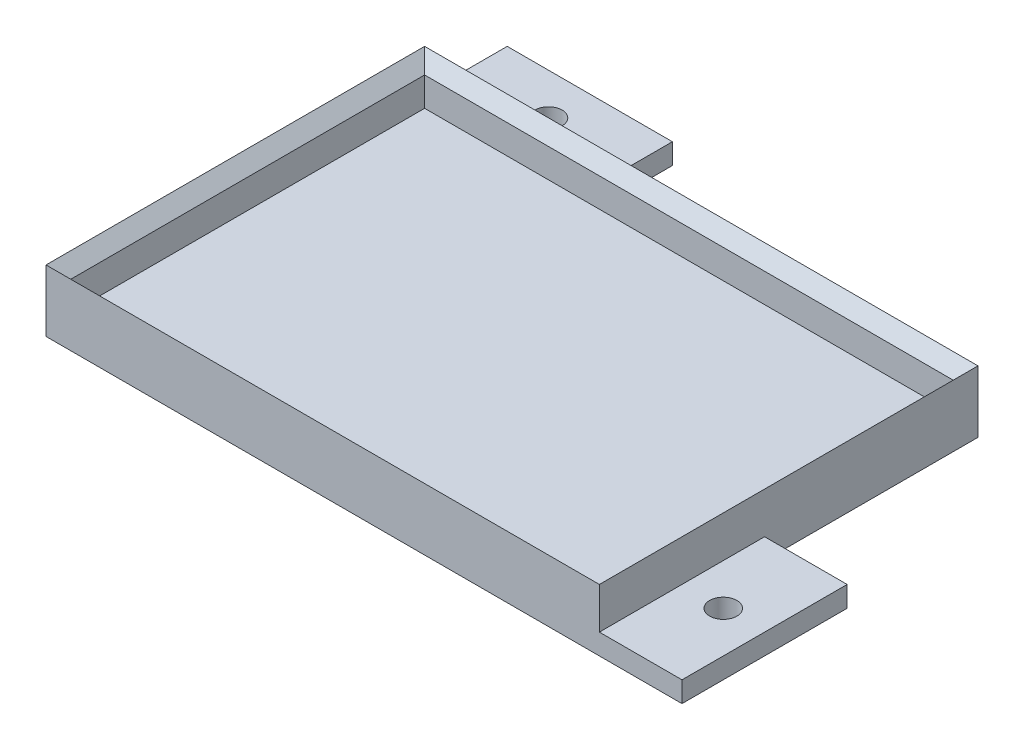
ISO-10303-21;
HEADER;
FILE_DESCRIPTION(('STEP AP214'),'2;1');
FILE_NAME('part.step','',(''),(''),'','','');
FILE_SCHEMA(('AUTOMOTIVE_DESIGN { 1 0 10303 214 1 1 1 1 }'));
ENDSEC;
DATA;
#1=APPLICATION_CONTEXT('core data for automotive mechanical design processes');
#2=APPLICATION_PROTOCOL_DEFINITION('international standard','automotive_design',2000,#1);
#3=PRODUCT_CONTEXT('',#1,'mechanical');
#4=PRODUCT('Part','Part','',(#3));
#5=PRODUCT_RELATED_PRODUCT_CATEGORY('part','',(#4));
#6=PRODUCT_DEFINITION_FORMATION('','',#4);
#7=PRODUCT_DEFINITION_CONTEXT('part definition',#1,'design');
#8=PRODUCT_DEFINITION('design','',#6,#7);
#9=PRODUCT_DEFINITION_SHAPE('','',#8);
#10=(LENGTH_UNIT() NAMED_UNIT(*) SI_UNIT(.MILLI.,.METRE.));
#11=(NAMED_UNIT(*) PLANE_ANGLE_UNIT() SI_UNIT($,.RADIAN.));
#12=(NAMED_UNIT(*) SI_UNIT($,.STERADIAN.) SOLID_ANGLE_UNIT());
#13=UNCERTAINTY_MEASURE_WITH_UNIT(LENGTH_MEASURE(1.E-05),#10,'distance_accuracy_value','');
#14=(GEOMETRIC_REPRESENTATION_CONTEXT(3) GLOBAL_UNCERTAINTY_ASSIGNED_CONTEXT((#13)) GLOBAL_UNIT_ASSIGNED_CONTEXT((#10,
#11,#12)) REPRESENTATION_CONTEXT('',''));
#15=CARTESIAN_POINT('',(0.,0.,0.));
#16=DIRECTION('',(0.,0.,1.));
#17=DIRECTION('',(1.,0.,0.));
#18=AXIS2_PLACEMENT_3D('',#15,#16,#17);
#19=CARTESIAN_POINT('',(0.,5.,0.));
#20=DIRECTION('',(0.,1.,0.));
#21=DIRECTION('',(0.,0.,1.));
#22=AXIS2_PLACEMENT_3D('',#19,#20,#21);
#23=PLANE('',#22);
#24=DIRECTION('',(0.,0.,-1.));
#25=VECTOR('',#24,1.);
#26=CARTESIAN_POINT('',(67.,5.,-45.84));
#27=LINE('',#26,#25);
#28=CARTESIAN_POINT('',(67.,5.,45.84));
#29=VERTEX_POINT('',#28);
#30=CARTESIAN_POINT('',(67.,5.,5.83999999999999));
#31=VERTEX_POINT('',#30);
#32=EDGE_CURVE('E161',#29,#31,#27,.T.);
#33=ORIENTED_EDGE('',*,*,#32,.F.);
#34=DIRECTION('',(1.,0.,0.));
#35=VECTOR('',#34,1.);
#36=CARTESIAN_POINT('',(-67.,5.,45.84));
#37=LINE('',#36,#35);
#38=CARTESIAN_POINT('',(87.,5.,45.84));
#39=VERTEX_POINT('',#38);
#40=EDGE_CURVE('E296',#29,#39,#37,.T.);
#41=ORIENTED_EDGE('',*,*,#40,.T.);
#42=DIRECTION('',(0.,0.,-1.));
#43=VECTOR('',#42,1.);
#44=CARTESIAN_POINT('',(87.,5.,45.84));
#45=LINE('',#44,#43);
#46=CARTESIAN_POINT('',(87.,5.,5.83999999999999));
#47=VERTEX_POINT('',#46);
#48=EDGE_CURVE('E259',#39,#47,#45,.T.);
#49=ORIENTED_EDGE('',*,*,#48,.T.);
#50=DIRECTION('',(-1.,0.,0.));
#51=VECTOR('',#50,1.);
#52=CARTESIAN_POINT('',(67.,5.,5.83999999999999));
#53=LINE('',#52,#51);
#54=EDGE_CURVE('E254',#47,#31,#53,.T.);
#55=ORIENTED_EDGE('',*,*,#54,.T.);
#56=EDGE_LOOP('',(#33,#41,#49,#55));
#57=FACE_BOUND('',#56,.T.);
#58=CARTESIAN_POINT('',(77.,5.,25.84));
#59=DIRECTION('',(0.,1.,0.));
#60=DIRECTION('',(0.,0.,1.));
#61=AXIS2_PLACEMENT_3D('',#58,#59,#60);
#62=CIRCLE('',#61,3.3);
#63=CARTESIAN_POINT('',(77.,5.,29.14));
#64=VERTEX_POINT('',#63);
#65=EDGE_CURVE('E234',#64,#64,#62,.T.);
#66=ORIENTED_EDGE('',*,*,#65,.F.);
#67=EDGE_LOOP('',(#66));
#68=FACE_BOUND('',#67,.T.);
#69=ADVANCED_FACE('F47',(#57,#68),#23,.T.);
#70=CARTESIAN_POINT('',(-67.,5.,-45.84));
#71=DIRECTION('',(0.,0.,1.));
#72=DIRECTION('',(1.,0.,0.));
#73=AXIS2_PLACEMENT_3D('',#70,#71,#72);
#74=PLANE('',#73);
#75=DIRECTION('',(0.,-1.,0.));
#76=VECTOR('',#75,1.);
#77=CARTESIAN_POINT('',(-27.,5.,-45.84));
#78=LINE('',#77,#76);
#79=CARTESIAN_POINT('',(-27.,5.,-45.84));
#80=VERTEX_POINT('',#79);
#81=CARTESIAN_POINT('',(-27.,0.,-45.84));
#82=VERTEX_POINT('',#81);
#83=EDGE_CURVE('E288',#80,#82,#78,.T.);
#84=ORIENTED_EDGE('',*,*,#83,.F.);
#85=DIRECTION('',(-1.,0.,0.));
#86=VECTOR('',#85,1.);
#87=CARTESIAN_POINT('',(67.,5.,-45.84));
#88=LINE('',#87,#86);
#89=CARTESIAN_POINT('',(-67.,5.,-45.84));
#90=VERTEX_POINT('',#89);
#91=EDGE_CURVE('E214',#80,#90,#88,.T.);
#92=ORIENTED_EDGE('',*,*,#91,.T.);
#93=DIRECTION('',(0.,-1.,0.));
#94=VECTOR('',#93,1.);
#95=CARTESIAN_POINT('',(-67.,15.,-45.84));
#96=LINE('',#95,#94);
#97=CARTESIAN_POINT('',(-67.,15.,-45.84));
#98=VERTEX_POINT('',#97);
#99=EDGE_CURVE('E222',#98,#90,#96,.T.);
#100=ORIENTED_EDGE('',*,*,#99,.F.);
#101=DIRECTION('',(-1.,0.,0.));
#102=VECTOR('',#101,1.);
#103=CARTESIAN_POINT('',(67.,15.,-45.84));
#104=LINE('',#103,#102);
#105=CARTESIAN_POINT('',(67.,15.,-45.84));
#106=VERTEX_POINT('',#105);
#107=EDGE_CURVE('E198',#106,#98,#104,.T.);
#108=ORIENTED_EDGE('',*,*,#107,.F.);
#109=DIRECTION('',(0.,-1.,0.));
#110=VECTOR('',#109,1.);
#111=CARTESIAN_POINT('',(67.,5.,-45.84));
#112=LINE('',#111,#110);
#113=CARTESIAN_POINT('',(67.,0.,-45.84));
#114=VERTEX_POINT('',#113);
#115=EDGE_CURVE('E300',#106,#114,#112,.T.);
#116=ORIENTED_EDGE('',*,*,#115,.T.);
#117=DIRECTION('',(-1.,0.,0.));
#118=VECTOR('',#117,1.);
#119=CARTESIAN_POINT('',(-67.,0.,-45.84));
#120=LINE('',#119,#118);
#121=EDGE_CURVE('E297',#114,#82,#120,.T.);
#122=ORIENTED_EDGE('',*,*,#121,.T.);
#123=EDGE_LOOP('',(#84,#92,#100,#108,#116,#122));
#124=FACE_BOUND('',#123,.T.);
#125=ADVANCED_FACE('F355',(#124),#74,.F.);
#126=CARTESIAN_POINT('',(-67.,5.,-45.84));
#127=DIRECTION('',(1.,0.,0.));
#128=DIRECTION('',(0.,0.,-1.));
#129=AXIS2_PLACEMENT_3D('',#126,#127,#128);
#130=PLANE('',#129);
#131=DIRECTION('',(0.,0.,1.));
#132=VECTOR('',#131,1.);
#133=CARTESIAN_POINT('',(-67.,0.,-45.84));
#134=LINE('',#133,#132);
#135=CARTESIAN_POINT('',(-67.,0.,-65.84));
#136=VERTEX_POINT('',#135);
#137=CARTESIAN_POINT('',(-67.,0.,45.84));
#138=VERTEX_POINT('',#137);
#139=EDGE_CURVE('E292',#136,#138,#134,.T.);
#140=ORIENTED_EDGE('',*,*,#139,.T.);
#141=DIRECTION('',(0.,-1.,0.));
#142=VECTOR('',#141,1.);
#143=CARTESIAN_POINT('',(-67.,5.,45.84));
#144=LINE('',#143,#142);
#145=CARTESIAN_POINT('',(-67.,15.,45.84));
#146=VERTEX_POINT('',#145);
#147=EDGE_CURVE('E218',#146,#138,#144,.T.);
#148=ORIENTED_EDGE('',*,*,#147,.F.);
#149=DIRECTION('',(0.,0.,1.));
#150=VECTOR('',#149,1.);
#151=CARTESIAN_POINT('',(-67.,15.,-45.84));
#152=LINE('',#151,#150);
#153=EDGE_CURVE('E202',#98,#146,#152,.T.);
#154=ORIENTED_EDGE('',*,*,#153,.F.);
#155=ORIENTED_EDGE('',*,*,#99,.T.);
#156=DIRECTION('',(0.,0.,1.));
#157=VECTOR('',#156,1.);
#158=CARTESIAN_POINT('',(-67.,5.,-45.84));
#159=LINE('',#158,#157);
#160=CARTESIAN_POINT('',(-67.,5.,-65.84));
#161=VERTEX_POINT('',#160);
#162=EDGE_CURVE('E293',#161,#90,#159,.T.);
#163=ORIENTED_EDGE('',*,*,#162,.F.);
#164=DIRECTION('',(0.,-1.,0.));
#165=VECTOR('',#164,1.);
#166=CARTESIAN_POINT('',(-67.,5.,-65.84));
#167=LINE('',#166,#165);
#168=EDGE_CURVE('E275',#161,#136,#167,.T.);
#169=ORIENTED_EDGE('',*,*,#168,.T.);
#170=EDGE_LOOP('',(#140,#148,#154,#155,#163,#169));
#171=FACE_BOUND('',#170,.T.);
#172=ADVANCED_FACE('F364',(#171),#130,.F.);
#173=CARTESIAN_POINT('',(-67.,5.,45.84));
#174=DIRECTION('',(0.,0.,-1.));
#175=DIRECTION('',(-1.,0.,0.));
#176=AXIS2_PLACEMENT_3D('',#173,#174,#175);
#177=PLANE('',#176);
#178=DIRECTION('',(1.,0.,0.));
#179=VECTOR('',#178,1.);
#180=CARTESIAN_POINT('',(-67.,0.,45.84));
#181=LINE('',#180,#179);
#182=CARTESIAN_POINT('',(87.,0.,45.84));
#183=VERTEX_POINT('',#182);
#184=EDGE_CURVE('E304',#138,#183,#181,.T.);
#185=ORIENTED_EDGE('',*,*,#184,.T.);
#186=DIRECTION('',(0.,-1.,0.));
#187=VECTOR('',#186,1.);
#188=CARTESIAN_POINT('',(87.,5.,45.84));
#189=LINE('',#188,#187);
#190=EDGE_CURVE('E242',#39,#183,#189,.T.);
#191=ORIENTED_EDGE('',*,*,#190,.F.);
#192=ORIENTED_EDGE('',*,*,#40,.F.);
#193=DIRECTION('',(0.,-1.,0.));
#194=VECTOR('',#193,1.);
#195=CARTESIAN_POINT('',(67.,15.,45.84));
#196=LINE('',#195,#194);
#197=CARTESIAN_POINT('',(67.,15.,45.84));
#198=VERTEX_POINT('',#197);
#199=EDGE_CURVE('E210',#198,#29,#196,.T.);
#200=ORIENTED_EDGE('',*,*,#199,.F.);
#201=DIRECTION('',(1.,0.,0.));
#202=VECTOR('',#201,1.);
#203=CARTESIAN_POINT('',(67.,15.,45.84));
#204=LINE('',#203,#202);
#205=EDGE_CURVE('E206',#146,#198,#204,.T.);
#206=ORIENTED_EDGE('',*,*,#205,.F.);
#207=ORIENTED_EDGE('',*,*,#147,.T.);
#208=EDGE_LOOP('',(#185,#191,#192,#200,#206,#207));
#209=FACE_BOUND('',#208,.T.);
#210=ADVANCED_FACE('F381',(#209),#177,.F.);
#211=CARTESIAN_POINT('',(67.,5.,-45.84));
#212=DIRECTION('',(-1.,0.,0.));
#213=DIRECTION('',(0.,0.,1.));
#214=AXIS2_PLACEMENT_3D('',#211,#212,#213);
#215=PLANE('',#214);
#216=ORIENTED_EDGE('',*,*,#115,.F.);
#217=DIRECTION('',(0.,0.,-1.));
#218=VECTOR('',#217,1.);
#219=CARTESIAN_POINT('',(67.,15.,-45.84));
#220=LINE('',#219,#218);
#221=EDGE_CURVE('E194',#198,#106,#220,.T.);
#222=ORIENTED_EDGE('',*,*,#221,.F.);
#223=ORIENTED_EDGE('',*,*,#199,.T.);
#224=ORIENTED_EDGE('',*,*,#32,.T.);
#225=DIRECTION('',(0.,-1.,0.));
#226=VECTOR('',#225,1.);
#227=CARTESIAN_POINT('',(67.,5.,5.83999999999999));
#228=LINE('',#227,#226);
#229=CARTESIAN_POINT('',(67.,0.,5.83999999999999));
#230=VERTEX_POINT('',#229);
#231=EDGE_CURVE('E250',#31,#230,#228,.T.);
#232=ORIENTED_EDGE('',*,*,#231,.T.);
#233=DIRECTION('',(0.,0.,-1.));
#234=VECTOR('',#233,1.);
#235=CARTESIAN_POINT('',(67.,0.,-45.84));
#236=LINE('',#235,#234);
#237=EDGE_CURVE('E307',#230,#114,#236,.T.);
#238=ORIENTED_EDGE('',*,*,#237,.T.);
#239=EDGE_LOOP('',(#216,#222,#223,#224,#232,#238));
#240=FACE_BOUND('',#239,.T.);
#241=ADVANCED_FACE('F372',(#240),#215,.F.);
#242=ORIENTED_EDGE('',*,*,#91,.F.);
#243=DIRECTION('',(0.,0.,-1.));
#244=VECTOR('',#243,1.);
#245=CARTESIAN_POINT('',(-27.,5.,-45.84));
#246=LINE('',#245,#244);
#247=CARTESIAN_POINT('',(-27.,5.,-65.84));
#248=VERTEX_POINT('',#247);
#249=EDGE_CURVE('E267',#80,#248,#246,.T.);
#250=ORIENTED_EDGE('',*,*,#249,.T.);
#251=DIRECTION('',(-1.,0.,0.));
#252=VECTOR('',#251,1.);
#253=CARTESIAN_POINT('',(-67.,5.,-65.84));
#254=LINE('',#253,#252);
#255=EDGE_CURVE('E270',#248,#161,#254,.T.);
#256=ORIENTED_EDGE('',*,*,#255,.T.);
#257=ORIENTED_EDGE('',*,*,#162,.T.);
#258=EDGE_LOOP('',(#242,#250,#256,#257));
#259=FACE_BOUND('',#258,.T.);
#260=CARTESIAN_POINT('',(-47.,5.,-55.84));
#261=DIRECTION('',(0.,1.,0.));
#262=DIRECTION('',(0.,0.,1.));
#263=AXIS2_PLACEMENT_3D('',#260,#261,#262);
#264=CIRCLE('',#263,3.3);
#265=CARTESIAN_POINT('',(-47.,5.,-52.54));
#266=VERTEX_POINT('',#265);
#267=EDGE_CURVE('E226',#266,#266,#264,.T.);
#268=ORIENTED_EDGE('',*,*,#267,.F.);
#269=EDGE_LOOP('',(#268));
#270=FACE_BOUND('',#269,.T.);
#271=ADVANCED_FACE('F358',(#259,#270),#23,.T.);
#272=CARTESIAN_POINT('',(0.,0.,0.));
#273=DIRECTION('',(0.,1.,0.));
#274=DIRECTION('',(0.,0.,1.));
#275=AXIS2_PLACEMENT_3D('',#272,#273,#274);
#276=PLANE('',#275);
#277=CARTESIAN_POINT('',(-47.,0.,-55.84));
#278=DIRECTION('',(0.,1.,0.));
#279=DIRECTION('',(0.,0.,1.));
#280=AXIS2_PLACEMENT_3D('',#277,#278,#279);
#281=CIRCLE('',#280,3.3);
#282=CARTESIAN_POINT('',(-47.,0.,-52.54));
#283=VERTEX_POINT('',#282);
#284=EDGE_CURVE('E230',#283,#283,#281,.T.);
#285=ORIENTED_EDGE('',*,*,#284,.T.);
#286=EDGE_LOOP('',(#285));
#287=FACE_BOUND('',#286,.T.);
#288=CARTESIAN_POINT('',(77.,0.,25.84));
#289=DIRECTION('',(0.,1.,0.));
#290=DIRECTION('',(0.,0.,1.));
#291=AXIS2_PLACEMENT_3D('',#288,#289,#290);
#292=CIRCLE('',#291,3.3);
#293=CARTESIAN_POINT('',(77.,0.,29.14));
#294=VERTEX_POINT('',#293);
#295=EDGE_CURVE('E238',#294,#294,#292,.T.);
#296=ORIENTED_EDGE('',*,*,#295,.T.);
#297=EDGE_LOOP('',(#296));
#298=FACE_BOUND('',#297,.T.);
#299=ORIENTED_EDGE('',*,*,#139,.F.);
#300=DIRECTION('',(-1.,0.,0.));
#301=VECTOR('',#300,1.);
#302=CARTESIAN_POINT('',(-67.,0.,-65.84));
#303=LINE('',#302,#301);
#304=CARTESIAN_POINT('',(-27.,0.,-65.84));
#305=VERTEX_POINT('',#304);
#306=EDGE_CURVE('E271',#305,#136,#303,.T.);
#307=ORIENTED_EDGE('',*,*,#306,.F.);
#308=DIRECTION('',(0.,0.,-1.));
#309=VECTOR('',#308,1.);
#310=CARTESIAN_POINT('',(-27.,0.,-45.84));
#311=LINE('',#310,#309);
#312=EDGE_CURVE('E262',#82,#305,#311,.T.);
#313=ORIENTED_EDGE('',*,*,#312,.F.);
#314=ORIENTED_EDGE('',*,*,#121,.F.);
#315=ORIENTED_EDGE('',*,*,#237,.F.);
#316=DIRECTION('',(-1.,0.,0.));
#317=VECTOR('',#316,1.);
#318=CARTESIAN_POINT('',(67.,0.,5.83999999999999));
#319=LINE('',#318,#317);
#320=CARTESIAN_POINT('',(87.,0.,5.83999999999999));
#321=VERTEX_POINT('',#320);
#322=EDGE_CURVE('E255',#321,#230,#319,.T.);
#323=ORIENTED_EDGE('',*,*,#322,.F.);
#324=DIRECTION('',(0.,0.,-1.));
#325=VECTOR('',#324,1.);
#326=CARTESIAN_POINT('',(87.,0.,45.84));
#327=LINE('',#326,#325);
#328=EDGE_CURVE('E258',#183,#321,#327,.T.);
#329=ORIENTED_EDGE('',*,*,#328,.F.);
#330=ORIENTED_EDGE('',*,*,#184,.F.);
#331=EDGE_LOOP('',(#299,#307,#313,#314,#315,#323,#329,#330));
#332=FACE_BOUND('',#331,.T.);
#333=ADVANCED_FACE('F371',(#287,#298,#332),#276,.F.);
#334=CARTESIAN_POINT('',(-27.,5.,-45.84));
#335=DIRECTION('',(-1.,0.,0.));
#336=DIRECTION('',(0.,0.,1.));
#337=AXIS2_PLACEMENT_3D('',#334,#335,#336);
#338=PLANE('',#337);
#339=ORIENTED_EDGE('',*,*,#312,.T.);
#340=DIRECTION('',(0.,-1.,0.));
#341=VECTOR('',#340,1.);
#342=CARTESIAN_POINT('',(-27.,5.,-65.84));
#343=LINE('',#342,#341);
#344=EDGE_CURVE('E284',#248,#305,#343,.T.);
#345=ORIENTED_EDGE('',*,*,#344,.F.);
#346=ORIENTED_EDGE('',*,*,#249,.F.);
#347=ORIENTED_EDGE('',*,*,#83,.T.);
#348=EDGE_LOOP('',(#339,#345,#346,#347));
#349=FACE_BOUND('',#348,.T.);
#350=ADVANCED_FACE('F378',(#349),#338,.F.);
#351=CARTESIAN_POINT('',(-67.,5.,-65.84));
#352=DIRECTION('',(0.,0.,1.));
#353=DIRECTION('',(1.,0.,0.));
#354=AXIS2_PLACEMENT_3D('',#351,#352,#353);
#355=PLANE('',#354);
#356=ORIENTED_EDGE('',*,*,#306,.T.);
#357=ORIENTED_EDGE('',*,*,#168,.F.);
#358=ORIENTED_EDGE('',*,*,#255,.F.);
#359=ORIENTED_EDGE('',*,*,#344,.T.);
#360=EDGE_LOOP('',(#356,#357,#358,#359));
#361=FACE_BOUND('',#360,.T.);
#362=ADVANCED_FACE('F405',(#361),#355,.F.);
#363=CARTESIAN_POINT('',(87.,5.,45.84));
#364=DIRECTION('',(-1.,0.,0.));
#365=DIRECTION('',(0.,0.,1.));
#366=AXIS2_PLACEMENT_3D('',#363,#364,#365);
#367=PLANE('',#366);
#368=ORIENTED_EDGE('',*,*,#328,.T.);
#369=DIRECTION('',(0.,-1.,0.));
#370=VECTOR('',#369,1.);
#371=CARTESIAN_POINT('',(87.,5.,5.83999999999999));
#372=LINE('',#371,#370);
#373=EDGE_CURVE('E246',#47,#321,#372,.T.);
#374=ORIENTED_EDGE('',*,*,#373,.F.);
#375=ORIENTED_EDGE('',*,*,#48,.F.);
#376=ORIENTED_EDGE('',*,*,#190,.T.);
#377=EDGE_LOOP('',(#368,#374,#375,#376));
#378=FACE_BOUND('',#377,.T.);
#379=ADVANCED_FACE('F402',(#378),#367,.F.);
#380=CARTESIAN_POINT('',(67.,5.,5.83999999999999));
#381=DIRECTION('',(0.,0.,1.));
#382=DIRECTION('',(1.,0.,0.));
#383=AXIS2_PLACEMENT_3D('',#380,#381,#382);
#384=PLANE('',#383);
#385=ORIENTED_EDGE('',*,*,#322,.T.);
#386=ORIENTED_EDGE('',*,*,#231,.F.);
#387=ORIENTED_EDGE('',*,*,#54,.F.);
#388=ORIENTED_EDGE('',*,*,#373,.T.);
#389=EDGE_LOOP('',(#385,#386,#387,#388));
#390=FACE_BOUND('',#389,.T.);
#391=ADVANCED_FACE('F397',(#390),#384,.F.);
#392=CARTESIAN_POINT('',(77.,5.,25.84));
#393=DIRECTION('',(0.,1.,0.));
#394=DIRECTION('',(0.,0.,1.));
#395=AXIS2_PLACEMENT_3D('',#392,#393,#394);
#396=CYLINDRICAL_SURFACE('',#395,3.3);
#397=ORIENTED_EDGE('',*,*,#295,.F.);
#398=EDGE_LOOP('',(#397));
#399=FACE_BOUND('',#398,.T.);
#400=ORIENTED_EDGE('',*,*,#65,.T.);
#401=EDGE_LOOP('',(#400));
#402=FACE_BOUND('',#401,.T.);
#403=ADVANCED_FACE('F389',(#399,#402),#396,.F.);
#404=CARTESIAN_POINT('',(-47.,5.,-55.84));
#405=DIRECTION('',(0.,1.,0.));
#406=DIRECTION('',(0.,0.,1.));
#407=AXIS2_PLACEMENT_3D('',#404,#405,#406);
#408=CYLINDRICAL_SURFACE('',#407,3.3);
#409=ORIENTED_EDGE('',*,*,#284,.F.);
#410=EDGE_LOOP('',(#409));
#411=FACE_BOUND('',#410,.T.);
#412=ORIENTED_EDGE('',*,*,#267,.T.);
#413=EDGE_LOOP('',(#412));
#414=FACE_BOUND('',#413,.T.);
#415=ADVANCED_FACE('F388',(#411,#414),#408,.F.);
#416=CARTESIAN_POINT('',(-64.,15.,-42.84));
#417=DIRECTION('',(1.,0.,0.));
#418=DIRECTION('',(0.,0.,-1.));
#419=AXIS2_PLACEMENT_3D('',#416,#417,#418);
#420=PLANE('',#419);
#421=DIRECTION('',(0.,-1.,0.));
#422=VECTOR('',#421,1.);
#423=CARTESIAN_POINT('',(-64.,15.,-42.84));
#424=LINE('',#423,#422);
#425=CARTESIAN_POINT('',(-64.,12.,-42.84));
#426=VERTEX_POINT('',#425);
#427=CARTESIAN_POINT('',(-64.,5.,-42.84));
#428=VERTEX_POINT('',#427);
#429=EDGE_CURVE('E186',#426,#428,#424,.T.);
#430=ORIENTED_EDGE('',*,*,#429,.F.);
#431=DIRECTION('',(0.,0.,1.));
#432=VECTOR('',#431,1.);
#433=CARTESIAN_POINT('',(-64.,12.,42.84));
#434=LINE('',#433,#432);
#435=CARTESIAN_POINT('',(-64.,12.,42.84));
#436=VERTEX_POINT('',#435);
#437=EDGE_CURVE('E159',#426,#436,#434,.T.);
#438=ORIENTED_EDGE('',*,*,#437,.T.);
#439=DIRECTION('',(0.,-1.,0.));
#440=VECTOR('',#439,1.);
#441=CARTESIAN_POINT('',(-64.,15.,42.84));
#442=LINE('',#441,#440);
#443=CARTESIAN_POINT('',(-64.,5.,42.84));
#444=VERTEX_POINT('',#443);
#445=EDGE_CURVE('E151',#436,#444,#442,.T.);
#446=ORIENTED_EDGE('',*,*,#445,.T.);
#447=DIRECTION('',(0.,0.,1.));
#448=VECTOR('',#447,1.);
#449=CARTESIAN_POINT('',(-64.,5.,-42.84));
#450=LINE('',#449,#448);
#451=EDGE_CURVE('E156',#428,#444,#450,.T.);
#452=ORIENTED_EDGE('',*,*,#451,.F.);
#453=EDGE_LOOP('',(#430,#438,#446,#452));
#454=FACE_BOUND('',#453,.T.);
#455=ADVANCED_FACE('F154',(#454),#420,.T.);
#456=CARTESIAN_POINT('',(-64.,15.,42.84));
#457=DIRECTION('',(0.,0.,-1.));
#458=DIRECTION('',(-1.,0.,0.));
#459=AXIS2_PLACEMENT_3D('',#456,#457,#458);
#460=PLANE('',#459);
#461=ORIENTED_EDGE('',*,*,#445,.F.);
#462=DIRECTION('',(1.,0.,0.));
#463=VECTOR('',#462,1.);
#464=CARTESIAN_POINT('',(64.,12.,42.84));
#465=LINE('',#464,#463);
#466=CARTESIAN_POINT('',(64.,12.,42.84));
#467=VERTEX_POINT('',#466);
#468=EDGE_CURVE('E73',#436,#467,#465,.T.);
#469=ORIENTED_EDGE('',*,*,#468,.T.);
#470=DIRECTION('',(0.,-1.,0.));
#471=VECTOR('',#470,1.);
#472=CARTESIAN_POINT('',(64.,15.,42.84));
#473=LINE('',#472,#471);
#474=CARTESIAN_POINT('',(64.,5.,42.84));
#475=VERTEX_POINT('',#474);
#476=EDGE_CURVE('E162',#467,#475,#473,.T.);
#477=ORIENTED_EDGE('',*,*,#476,.T.);
#478=DIRECTION('',(1.,0.,0.));
#479=VECTOR('',#478,1.);
#480=CARTESIAN_POINT('',(-64.,5.,42.84));
#481=LINE('',#480,#479);
#482=EDGE_CURVE('E165',#444,#475,#481,.T.);
#483=ORIENTED_EDGE('',*,*,#482,.F.);
#484=EDGE_LOOP('',(#461,#469,#477,#483));
#485=FACE_BOUND('',#484,.T.);
#486=ADVANCED_FACE('F166',(#485),#460,.T.);
#487=CARTESIAN_POINT('',(64.,15.,-42.84));
#488=DIRECTION('',(-1.,0.,0.));
#489=DIRECTION('',(0.,0.,1.));
#490=AXIS2_PLACEMENT_3D('',#487,#488,#489);
#491=PLANE('',#490);
#492=ORIENTED_EDGE('',*,*,#476,.F.);
#493=DIRECTION('',(0.,0.,-1.));
#494=VECTOR('',#493,1.);
#495=CARTESIAN_POINT('',(64.,12.,-42.84));
#496=LINE('',#495,#494);
#497=CARTESIAN_POINT('',(64.,12.,-42.84));
#498=VERTEX_POINT('',#497);
#499=EDGE_CURVE('E58',#467,#498,#496,.T.);
#500=ORIENTED_EDGE('',*,*,#499,.T.);
#501=DIRECTION('',(0.,-1.,0.));
#502=VECTOR('',#501,1.);
#503=CARTESIAN_POINT('',(64.,15.,-42.84));
#504=LINE('',#503,#502);
#505=CARTESIAN_POINT('',(64.,5.,-42.84));
#506=VERTEX_POINT('',#505);
#507=EDGE_CURVE('E189',#498,#506,#504,.T.);
#508=ORIENTED_EDGE('',*,*,#507,.T.);
#509=DIRECTION('',(0.,0.,-1.));
#510=VECTOR('',#509,1.);
#511=CARTESIAN_POINT('',(64.,5.,-42.84));
#512=LINE('',#511,#510);
#513=EDGE_CURVE('E171',#475,#506,#512,.T.);
#514=ORIENTED_EDGE('',*,*,#513,.F.);
#515=EDGE_LOOP('',(#492,#500,#508,#514));
#516=FACE_BOUND('',#515,.T.);
#517=ADVANCED_FACE('F345',(#516),#491,.T.);
#518=CARTESIAN_POINT('',(-64.,15.,-42.84));
#519=DIRECTION('',(0.,0.,1.));
#520=DIRECTION('',(1.,0.,0.));
#521=AXIS2_PLACEMENT_3D('',#518,#519,#520);
#522=PLANE('',#521);
#523=ORIENTED_EDGE('',*,*,#507,.F.);
#524=DIRECTION('',(-1.,0.,0.));
#525=VECTOR('',#524,1.);
#526=CARTESIAN_POINT('',(-64.,12.,-42.84));
#527=LINE('',#526,#525);
#528=EDGE_CURVE('E11',#498,#426,#527,.T.);
#529=ORIENTED_EDGE('',*,*,#528,.T.);
#530=ORIENTED_EDGE('',*,*,#429,.T.);
#531=DIRECTION('',(-1.,0.,0.));
#532=VECTOR('',#531,1.);
#533=CARTESIAN_POINT('',(-64.,5.,-42.84));
#534=LINE('',#533,#532);
#535=EDGE_CURVE('E175',#506,#428,#534,.T.);
#536=ORIENTED_EDGE('',*,*,#535,.F.);
#537=EDGE_LOOP('',(#523,#529,#530,#536));
#538=FACE_BOUND('',#537,.T.);
#539=ADVANCED_FACE('F344',(#538),#522,.T.);
#540=ORIENTED_EDGE('',*,*,#513,.T.);
#541=ORIENTED_EDGE('',*,*,#535,.T.);
#542=ORIENTED_EDGE('',*,*,#451,.T.);
#543=ORIENTED_EDGE('',*,*,#482,.T.);
#544=EDGE_LOOP('',(#540,#541,#542,#543));
#545=FACE_BOUND('',#544,.T.);
#546=ADVANCED_FACE('F173',(#545),#23,.T.);
#547=CARTESIAN_POINT('',(64.,12.,-42.84));
#548=DIRECTION('',(-0.707106781186547,0.707106781186547,0.));
#549=DIRECTION('',(0.,0.,1.));
#550=AXIS2_PLACEMENT_3D('',#547,#548,#549);
#551=PLANE('',#550);
#552=DIRECTION('',(0.577350269189626,0.577350269189626,0.577350269189626));
#553=VECTOR('',#552,1.);
#554=CARTESIAN_POINT('',(21.3333333333333,-30.6666666666667,0.173333333333296));
#555=LINE('',#554,#553);
#556=EDGE_CURVE('E180',#198,#467,#555,.F.);
#557=ORIENTED_EDGE('',*,*,#556,.F.);
#558=ORIENTED_EDGE('',*,*,#221,.T.);
#559=DIRECTION('',(0.577350269189626,0.577350269189626,-0.577350269189626));
#560=VECTOR('',#559,1.);
#561=CARTESIAN_POINT('',(64.,12.,-42.84));
#562=LINE('',#561,#560);
#563=EDGE_CURVE('E52',#498,#106,#562,.T.);
#564=ORIENTED_EDGE('',*,*,#563,.F.);
#565=ORIENTED_EDGE('',*,*,#499,.F.);
#566=EDGE_LOOP('',(#557,#558,#564,#565));
#567=FACE_BOUND('',#566,.T.);
#568=ADVANCED_FACE('F50',(#567),#551,.T.);
#569=CARTESIAN_POINT('',(-64.,12.,-42.84));
#570=DIRECTION('',(0.,0.707106781186547,0.707106781186547));
#571=DIRECTION('',(1.,0.,0.));
#572=AXIS2_PLACEMENT_3D('',#569,#570,#571);
#573=PLANE('',#572);
#574=ORIENTED_EDGE('',*,*,#563,.T.);
#575=ORIENTED_EDGE('',*,*,#107,.T.);
#576=DIRECTION('',(0.577350269189626,-0.577350269189626,0.577350269189626));
#577=VECTOR('',#576,1.);
#578=CARTESIAN_POINT('',(-64.,12.,-42.84));
#579=LINE('',#578,#577);
#580=EDGE_CURVE('E327',#426,#98,#579,.F.);
#581=ORIENTED_EDGE('',*,*,#580,.F.);
#582=ORIENTED_EDGE('',*,*,#528,.F.);
#583=EDGE_LOOP('',(#574,#575,#581,#582));
#584=FACE_BOUND('',#583,.T.);
#585=ADVANCED_FACE('F342',(#584),#573,.T.);
#586=CARTESIAN_POINT('',(-64.,12.,42.84));
#587=DIRECTION('',(0.,0.707106781186547,-0.707106781186547));
#588=DIRECTION('',(-1.,0.,0.));
#589=AXIS2_PLACEMENT_3D('',#586,#587,#588);
#590=PLANE('',#589);
#591=ORIENTED_EDGE('',*,*,#556,.T.);
#592=ORIENTED_EDGE('',*,*,#468,.F.);
#593=DIRECTION('',(-0.577350269189626,0.577350269189626,0.577350269189626));
#594=VECTOR('',#593,1.);
#595=CARTESIAN_POINT('',(-35.44,-16.56,14.28));
#596=LINE('',#595,#594);
#597=EDGE_CURVE('E324',#146,#436,#596,.F.);
#598=ORIENTED_EDGE('',*,*,#597,.F.);
#599=ORIENTED_EDGE('',*,*,#205,.T.);
#600=EDGE_LOOP('',(#591,#592,#598,#599));
#601=FACE_BOUND('',#600,.T.);
#602=ADVANCED_FACE('F333',(#601),#590,.T.);
#603=CARTESIAN_POINT('',(-64.,12.,-42.84));
#604=DIRECTION('',(0.707106781186547,0.707106781186547,0.));
#605=DIRECTION('',(0.,0.,-1.));
#606=AXIS2_PLACEMENT_3D('',#603,#604,#605);
#607=PLANE('',#606);
#608=ORIENTED_EDGE('',*,*,#580,.T.);
#609=ORIENTED_EDGE('',*,*,#153,.T.);
#610=ORIENTED_EDGE('',*,*,#597,.T.);
#611=ORIENTED_EDGE('',*,*,#437,.F.);
#612=EDGE_LOOP('',(#608,#609,#610,#611));
#613=FACE_BOUND('',#612,.T.);
#614=ADVANCED_FACE('F438',(#613),#607,.T.);
#615=CLOSED_SHELL('',(#69,#125,#172,#210,#241,#271,#333,#350,#362,#379,#391,#403,#415,#455,#486,
#517,#539,#546,#568,#585,#602,#614));
#616=MANIFOLD_SOLID_BREP('B2',#615);
#617=ADVANCED_BREP_SHAPE_REPRESENTATION('',(#18,#616),#14);
#618=SHAPE_DEFINITION_REPRESENTATION(#9,#617);
ENDSEC;
END-ISO-10303-21;
